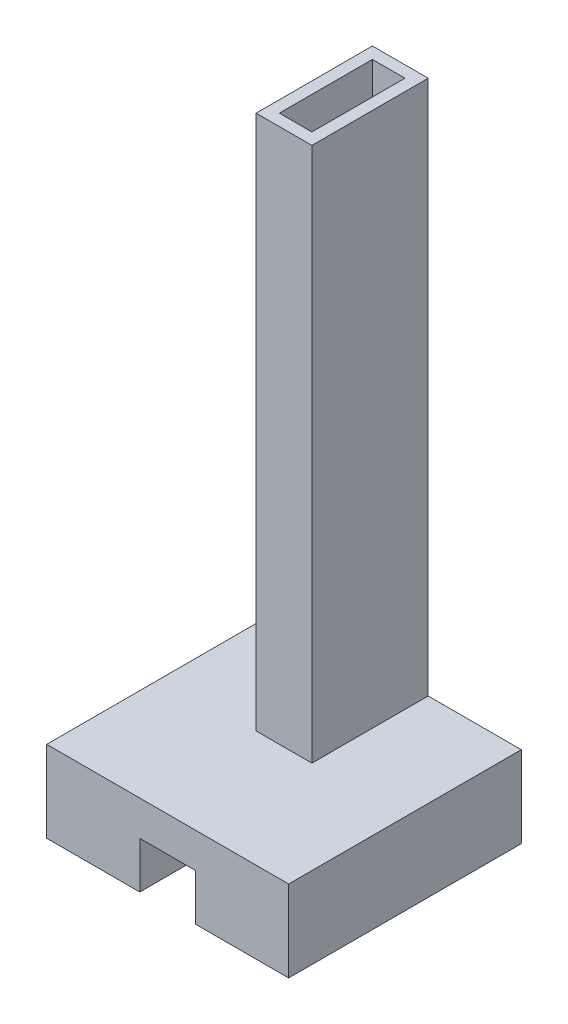
ISO-10303-21;
HEADER;
FILE_DESCRIPTION(('STEP AP214'),'2;1');
FILE_NAME('part.step','',(''),(''),'','','');
FILE_SCHEMA(('AUTOMOTIVE_DESIGN { 1 0 10303 214 1 1 1 1 }'));
ENDSEC;
DATA;
#1=APPLICATION_CONTEXT('core data for automotive mechanical design processes');
#2=APPLICATION_PROTOCOL_DEFINITION('international standard','automotive_design',2000,#1);
#3=PRODUCT_CONTEXT('',#1,'mechanical');
#4=PRODUCT('Part','Part','',(#3));
#5=PRODUCT_RELATED_PRODUCT_CATEGORY('part','',(#4));
#6=PRODUCT_DEFINITION_FORMATION('','',#4);
#7=PRODUCT_DEFINITION_CONTEXT('part definition',#1,'design');
#8=PRODUCT_DEFINITION('design','',#6,#7);
#9=PRODUCT_DEFINITION_SHAPE('','',#8);
#10=(LENGTH_UNIT() NAMED_UNIT(*) SI_UNIT(.MILLI.,.METRE.));
#11=(NAMED_UNIT(*) PLANE_ANGLE_UNIT() SI_UNIT($,.RADIAN.));
#12=(NAMED_UNIT(*) SI_UNIT($,.STERADIAN.) SOLID_ANGLE_UNIT());
#13=UNCERTAINTY_MEASURE_WITH_UNIT(LENGTH_MEASURE(1.E-05),#10,'distance_accuracy_value','');
#14=(GEOMETRIC_REPRESENTATION_CONTEXT(3) GLOBAL_UNCERTAINTY_ASSIGNED_CONTEXT((#13)) GLOBAL_UNIT_ASSIGNED_CONTEXT((#10,
#11,#12)) REPRESENTATION_CONTEXT('',''));
#15=CARTESIAN_POINT('',(0.,0.,0.));
#16=DIRECTION('',(0.,0.,1.));
#17=DIRECTION('',(1.,0.,0.));
#18=AXIS2_PLACEMENT_3D('',#15,#16,#17);
#19=CARTESIAN_POINT('',(0.,350.,1000.));
#20=DIRECTION('',(0.,-1.,0.));
#21=DIRECTION('',(0.,0.,-1.));
#22=AXIS2_PLACEMENT_3D('',#19,#20,#21);
#23=PLANE('',#22);
#24=DIRECTION('',(0.,0.,1.));
#25=VECTOR('',#24,1.);
#26=CARTESIAN_POINT('',(400.,350.,0.));
#27=LINE('',#26,#25);
#28=CARTESIAN_POINT('',(400.,350.,0.));
#29=VERTEX_POINT('',#28);
#30=CARTESIAN_POINT('',(400.,350.,500.));
#31=VERTEX_POINT('',#30);
#32=EDGE_CURVE('E200',#29,#31,#27,.T.);
#33=ORIENTED_EDGE('',*,*,#32,.F.);
#34=DIRECTION('',(-1.,0.,0.));
#35=VECTOR('',#34,1.);
#36=CARTESIAN_POINT('',(0.,350.,0.));
#37=LINE('',#36,#35);
#38=CARTESIAN_POINT('',(0.,350.,0.));
#39=VERTEX_POINT('',#38);
#40=EDGE_CURVE('E306',#29,#39,#37,.T.);
#41=ORIENTED_EDGE('',*,*,#40,.T.);
#42=DIRECTION('',(0.,0.,-1.));
#43=VECTOR('',#42,1.);
#44=CARTESIAN_POINT('',(0.,350.,1000.));
#45=LINE('',#44,#43);
#46=CARTESIAN_POINT('',(0.,350.,1000.));
#47=VERTEX_POINT('',#46);
#48=EDGE_CURVE('E294',#47,#39,#45,.T.);
#49=ORIENTED_EDGE('',*,*,#48,.F.);
#50=DIRECTION('',(-1.,0.,0.));
#51=VECTOR('',#50,1.);
#52=CARTESIAN_POINT('',(0.,350.,1000.));
#53=LINE('',#52,#51);
#54=CARTESIAN_POINT('',(1040.,350.,1000.));
#55=VERTEX_POINT('',#54);
#56=EDGE_CURVE('E291',#55,#47,#53,.T.);
#57=ORIENTED_EDGE('',*,*,#56,.F.);
#58=DIRECTION('',(0.,0.,-1.));
#59=VECTOR('',#58,1.);
#60=CARTESIAN_POINT('',(1040.,350.,1000.));
#61=LINE('',#60,#59);
#62=CARTESIAN_POINT('',(1040.,350.,0.));
#63=VERTEX_POINT('',#62);
#64=EDGE_CURVE('E312',#55,#63,#61,.T.);
#65=ORIENTED_EDGE('',*,*,#64,.T.);
#66=CARTESIAN_POINT('',(640.,350.,0.));
#67=VERTEX_POINT('',#66);
#68=EDGE_CURVE('E283',#63,#67,#37,.T.);
#69=ORIENTED_EDGE('',*,*,#68,.T.);
#70=DIRECTION('',(0.,0.,-1.));
#71=VECTOR('',#70,1.);
#72=CARTESIAN_POINT('',(640.,350.,0.));
#73=LINE('',#72,#71);
#74=CARTESIAN_POINT('',(640.,350.,500.));
#75=VERTEX_POINT('',#74);
#76=EDGE_CURVE('E206',#75,#67,#73,.T.);
#77=ORIENTED_EDGE('',*,*,#76,.F.);
#78=DIRECTION('',(1.,0.,0.));
#79=VECTOR('',#78,1.);
#80=CARTESIAN_POINT('',(400.,350.,500.));
#81=LINE('',#80,#79);
#82=EDGE_CURVE('E219',#31,#75,#81,.T.);
#83=ORIENTED_EDGE('',*,*,#82,.F.);
#84=EDGE_LOOP('',(#33,#41,#49,#57,#65,#69,#77,#83));
#85=FACE_BOUND('',#84,.T.);
#86=ADVANCED_FACE('F38',(#85),#23,.F.);
#87=CARTESIAN_POINT('',(0.,0.,1000.));
#88=DIRECTION('',(0.,1.,0.));
#89=DIRECTION('',(0.,0.,1.));
#90=AXIS2_PLACEMENT_3D('',#87,#88,#89);
#91=PLANE('',#90);
#92=DIRECTION('',(1.,0.,0.));
#93=VECTOR('',#92,1.);
#94=CARTESIAN_POINT('',(0.,0.,0.));
#95=LINE('',#94,#93);
#96=CARTESIAN_POINT('',(0.,0.,0.));
#97=VERTEX_POINT('',#96);
#98=CARTESIAN_POINT('',(400.,0.,0.));
#99=VERTEX_POINT('',#98);
#100=EDGE_CURVE('E299',#97,#99,#95,.T.);
#101=ORIENTED_EDGE('',*,*,#100,.T.);
#102=DIRECTION('',(0.,0.,1.));
#103=VECTOR('',#102,1.);
#104=CARTESIAN_POINT('',(400.,0.,0.));
#105=LINE('',#104,#103);
#106=CARTESIAN_POINT('',(400.,0.,1000.));
#107=VERTEX_POINT('',#106);
#108=EDGE_CURVE('E255',#99,#107,#105,.T.);
#109=ORIENTED_EDGE('',*,*,#108,.T.);
#110=DIRECTION('',(1.,0.,0.));
#111=VECTOR('',#110,1.);
#112=CARTESIAN_POINT('',(0.,0.,1000.));
#113=LINE('',#112,#111);
#114=CARTESIAN_POINT('',(0.,0.,1000.));
#115=VERTEX_POINT('',#114);
#116=EDGE_CURVE('E284',#115,#107,#113,.T.);
#117=ORIENTED_EDGE('',*,*,#116,.F.);
#118=DIRECTION('',(0.,0.,-1.));
#119=VECTOR('',#118,1.);
#120=CARTESIAN_POINT('',(0.,0.,1000.));
#121=LINE('',#120,#119);
#122=EDGE_CURVE('E11',#115,#97,#121,.T.);
#123=ORIENTED_EDGE('',*,*,#122,.T.);
#124=EDGE_LOOP('',(#101,#109,#117,#123));
#125=FACE_BOUND('',#124,.T.);
#126=ADVANCED_FACE('F361',(#125),#91,.F.);
#127=CARTESIAN_POINT('',(0.,0.,1000.));
#128=DIRECTION('',(1.,0.,0.));
#129=DIRECTION('',(0.,0.,-1.));
#130=AXIS2_PLACEMENT_3D('',#127,#128,#129);
#131=PLANE('',#130);
#132=DIRECTION('',(0.,-1.,0.));
#133=VECTOR('',#132,1.);
#134=CARTESIAN_POINT('',(0.,0.,0.));
#135=LINE('',#134,#133);
#136=EDGE_CURVE('E268',#39,#97,#135,.T.);
#137=ORIENTED_EDGE('',*,*,#136,.T.);
#138=ORIENTED_EDGE('',*,*,#122,.F.);
#139=DIRECTION('',(0.,-1.,0.));
#140=VECTOR('',#139,1.);
#141=CARTESIAN_POINT('',(0.,0.,1000.));
#142=LINE('',#141,#140);
#143=EDGE_CURVE('E278',#47,#115,#142,.T.);
#144=ORIENTED_EDGE('',*,*,#143,.F.);
#145=ORIENTED_EDGE('',*,*,#48,.T.);
#146=EDGE_LOOP('',(#137,#138,#144,#145));
#147=FACE_BOUND('',#146,.T.);
#148=ADVANCED_FACE('F40',(#147),#131,.F.);
#149=CARTESIAN_POINT('',(640.,0.,1000.));
#150=VERTEX_POINT('',#149);
#151=CARTESIAN_POINT('',(1040.,0.,1000.));
#152=VERTEX_POINT('',#151);
#153=EDGE_CURVE('E282',#150,#152,#113,.T.);
#154=ORIENTED_EDGE('',*,*,#153,.F.);
#155=DIRECTION('',(0.,0.,1.));
#156=VECTOR('',#155,1.);
#157=CARTESIAN_POINT('',(640.,0.,0.));
#158=LINE('',#157,#156);
#159=CARTESIAN_POINT('',(640.,0.,0.));
#160=VERTEX_POINT('',#159);
#161=EDGE_CURVE('E272',#160,#150,#158,.T.);
#162=ORIENTED_EDGE('',*,*,#161,.F.);
#163=CARTESIAN_POINT('',(1040.,0.,0.));
#164=VERTEX_POINT('',#163);
#165=EDGE_CURVE('E298',#160,#164,#95,.T.);
#166=ORIENTED_EDGE('',*,*,#165,.T.);
#167=DIRECTION('',(0.,0.,-1.));
#168=VECTOR('',#167,1.);
#169=CARTESIAN_POINT('',(1040.,0.,1000.));
#170=LINE('',#169,#168);
#171=EDGE_CURVE('E47',#152,#164,#170,.T.);
#172=ORIENTED_EDGE('',*,*,#171,.F.);
#173=EDGE_LOOP('',(#154,#162,#166,#172));
#174=FACE_BOUND('',#173,.T.);
#175=ADVANCED_FACE('F367',(#174),#91,.F.);
#176=CARTESIAN_POINT('',(1040.,0.,1000.));
#177=DIRECTION('',(-1.,0.,0.));
#178=DIRECTION('',(0.,0.,1.));
#179=AXIS2_PLACEMENT_3D('',#176,#177,#178);
#180=PLANE('',#179);
#181=DIRECTION('',(0.,1.,0.));
#182=VECTOR('',#181,1.);
#183=CARTESIAN_POINT('',(1040.,0.,0.));
#184=LINE('',#183,#182);
#185=EDGE_CURVE('E303',#164,#63,#184,.T.);
#186=ORIENTED_EDGE('',*,*,#185,.T.);
#187=ORIENTED_EDGE('',*,*,#64,.F.);
#188=DIRECTION('',(0.,1.,0.));
#189=VECTOR('',#188,1.);
#190=CARTESIAN_POINT('',(1040.,0.,1000.));
#191=LINE('',#190,#189);
#192=EDGE_CURVE('E288',#152,#55,#191,.T.);
#193=ORIENTED_EDGE('',*,*,#192,.F.);
#194=ORIENTED_EDGE('',*,*,#171,.T.);
#195=EDGE_LOOP('',(#186,#187,#193,#194));
#196=FACE_BOUND('',#195,.T.);
#197=ADVANCED_FACE('F321',(#196),#180,.F.);
#198=CARTESIAN_POINT('',(0.,0.,1000.));
#199=DIRECTION('',(0.,0.,-1.));
#200=DIRECTION('',(-1.,0.,0.));
#201=AXIS2_PLACEMENT_3D('',#198,#199,#200);
#202=PLANE('',#201);
#203=ORIENTED_EDGE('',*,*,#116,.T.);
#204=DIRECTION('',(0.,-1.,0.));
#205=VECTOR('',#204,1.);
#206=CARTESIAN_POINT('',(400.,0.,1000.));
#207=LINE('',#206,#205);
#208=CARTESIAN_POINT('',(400.,200.,1000.));
#209=VERTEX_POINT('',#208);
#210=EDGE_CURVE('E241',#209,#107,#207,.T.);
#211=ORIENTED_EDGE('',*,*,#210,.F.);
#212=DIRECTION('',(-1.,0.,0.));
#213=VECTOR('',#212,1.);
#214=CARTESIAN_POINT('',(400.,200.,1000.));
#215=LINE('',#214,#213);
#216=CARTESIAN_POINT('',(640.,200.,1000.));
#217=VERTEX_POINT('',#216);
#218=EDGE_CURVE('E247',#217,#209,#215,.T.);
#219=ORIENTED_EDGE('',*,*,#218,.F.);
#220=DIRECTION('',(0.,1.,0.));
#221=VECTOR('',#220,1.);
#222=CARTESIAN_POINT('',(640.,0.,1000.));
#223=LINE('',#222,#221);
#224=EDGE_CURVE('E258',#150,#217,#223,.T.);
#225=ORIENTED_EDGE('',*,*,#224,.F.);
#226=ORIENTED_EDGE('',*,*,#153,.T.);
#227=ORIENTED_EDGE('',*,*,#192,.T.);
#228=ORIENTED_EDGE('',*,*,#56,.T.);
#229=ORIENTED_EDGE('',*,*,#143,.T.);
#230=EDGE_LOOP('',(#203,#211,#219,#225,#226,#227,#228,#229));
#231=FACE_BOUND('',#230,.T.);
#232=ADVANCED_FACE('F372',(#231),#202,.F.);
#233=CARTESIAN_POINT('',(0.,0.,0.));
#234=DIRECTION('',(0.,0.,-1.));
#235=DIRECTION('',(-1.,0.,0.));
#236=AXIS2_PLACEMENT_3D('',#233,#234,#235);
#237=PLANE('',#236);
#238=DIRECTION('',(0.,-1.,0.));
#239=VECTOR('',#238,1.);
#240=CARTESIAN_POINT('',(400.,0.,0.));
#241=LINE('',#240,#239);
#242=CARTESIAN_POINT('',(400.,200.,0.));
#243=VERTEX_POINT('',#242);
#244=EDGE_CURVE('E242',#243,#99,#241,.T.);
#245=ORIENTED_EDGE('',*,*,#244,.T.);
#246=ORIENTED_EDGE('',*,*,#100,.F.);
#247=ORIENTED_EDGE('',*,*,#136,.F.);
#248=ORIENTED_EDGE('',*,*,#40,.F.);
#249=DIRECTION('',(0.,-1.,0.));
#250=VECTOR('',#249,1.);
#251=CARTESIAN_POINT('',(400.,2650.,0.));
#252=LINE('',#251,#250);
#253=CARTESIAN_POINT('',(400.,2650.,0.));
#254=VERTEX_POINT('',#253);
#255=EDGE_CURVE('E215',#254,#29,#252,.T.);
#256=ORIENTED_EDGE('',*,*,#255,.F.);
#257=DIRECTION('',(-1.,0.,0.));
#258=VECTOR('',#257,1.);
#259=CARTESIAN_POINT('',(400.,2650.,0.));
#260=LINE('',#259,#258);
#261=CARTESIAN_POINT('',(640.,2650.,0.));
#262=VERTEX_POINT('',#261);
#263=EDGE_CURVE('E212',#262,#254,#260,.T.);
#264=ORIENTED_EDGE('',*,*,#263,.F.);
#265=DIRECTION('',(0.,-1.,0.));
#266=VECTOR('',#265,1.);
#267=CARTESIAN_POINT('',(640.,2650.,0.));
#268=LINE('',#267,#266);
#269=EDGE_CURVE('E229',#262,#67,#268,.T.);
#270=ORIENTED_EDGE('',*,*,#269,.T.);
#271=ORIENTED_EDGE('',*,*,#68,.F.);
#272=ORIENTED_EDGE('',*,*,#185,.F.);
#273=ORIENTED_EDGE('',*,*,#165,.F.);
#274=DIRECTION('',(0.,1.,0.));
#275=VECTOR('',#274,1.);
#276=CARTESIAN_POINT('',(640.,0.,0.));
#277=LINE('',#276,#275);
#278=CARTESIAN_POINT('',(640.,200.,0.));
#279=VERTEX_POINT('',#278);
#280=EDGE_CURVE('E246',#160,#279,#277,.T.);
#281=ORIENTED_EDGE('',*,*,#280,.T.);
#282=DIRECTION('',(-1.,0.,0.));
#283=VECTOR('',#282,1.);
#284=CARTESIAN_POINT('',(400.,200.,0.));
#285=LINE('',#284,#283);
#286=EDGE_CURVE('E251',#279,#243,#285,.T.);
#287=ORIENTED_EDGE('',*,*,#286,.T.);
#288=EDGE_LOOP('',(#245,#246,#247,#248,#256,#264,#270,#271,#272,#273,#281,#287));
#289=FACE_BOUND('',#288,.T.);
#290=ADVANCED_FACE('F328',(#289),#237,.T.);
#291=CARTESIAN_POINT('',(400.,0.,0.));
#292=DIRECTION('',(-1.,0.,0.));
#293=DIRECTION('',(0.,0.,1.));
#294=AXIS2_PLACEMENT_3D('',#291,#292,#293);
#295=PLANE('',#294);
#296=ORIENTED_EDGE('',*,*,#210,.T.);
#297=ORIENTED_EDGE('',*,*,#108,.F.);
#298=ORIENTED_EDGE('',*,*,#244,.F.);
#299=DIRECTION('',(0.,0.,1.));
#300=VECTOR('',#299,1.);
#301=CARTESIAN_POINT('',(400.,200.,0.));
#302=LINE('',#301,#300);
#303=EDGE_CURVE('E265',#243,#209,#302,.T.);
#304=ORIENTED_EDGE('',*,*,#303,.T.);
#305=EDGE_LOOP('',(#296,#297,#298,#304));
#306=FACE_BOUND('',#305,.T.);
#307=ADVANCED_FACE('F392',(#306),#295,.F.);
#308=CARTESIAN_POINT('',(400.,200.,0.));
#309=DIRECTION('',(0.,1.,0.));
#310=DIRECTION('',(0.,0.,1.));
#311=AXIS2_PLACEMENT_3D('',#308,#309,#310);
#312=PLANE('',#311);
#313=DIRECTION('',(-1.,0.,0.));
#314=VECTOR('',#313,1.);
#315=CARTESIAN_POINT('',(400.,200.,50.));
#316=LINE('',#315,#314);
#317=CARTESIAN_POINT('',(590.,200.,50.));
#318=VERTEX_POINT('',#317);
#319=CARTESIAN_POINT('',(450.,200.,50.));
#320=VERTEX_POINT('',#319);
#321=EDGE_CURVE('E192',#318,#320,#316,.T.);
#322=ORIENTED_EDGE('',*,*,#321,.T.);
#323=DIRECTION('',(0.,0.,1.));
#324=VECTOR('',#323,1.);
#325=CARTESIAN_POINT('',(450.,200.,0.));
#326=LINE('',#325,#324);
#327=CARTESIAN_POINT('',(450.,200.,450.));
#328=VERTEX_POINT('',#327);
#329=EDGE_CURVE('E196',#320,#328,#326,.T.);
#330=ORIENTED_EDGE('',*,*,#329,.T.);
#331=DIRECTION('',(1.,0.,0.));
#332=VECTOR('',#331,1.);
#333=CARTESIAN_POINT('',(400.,200.,450.));
#334=LINE('',#333,#332);
#335=CARTESIAN_POINT('',(590.,200.,450.));
#336=VERTEX_POINT('',#335);
#337=EDGE_CURVE('E183',#328,#336,#334,.T.);
#338=ORIENTED_EDGE('',*,*,#337,.T.);
#339=DIRECTION('',(0.,0.,-1.));
#340=VECTOR('',#339,1.);
#341=CARTESIAN_POINT('',(590.,200.,0.));
#342=LINE('',#341,#340);
#343=EDGE_CURVE('E158',#336,#318,#342,.T.);
#344=ORIENTED_EDGE('',*,*,#343,.T.);
#345=EDGE_LOOP('',(#322,#330,#338,#344));
#346=FACE_BOUND('',#345,.T.);
#347=ORIENTED_EDGE('',*,*,#218,.T.);
#348=ORIENTED_EDGE('',*,*,#303,.F.);
#349=ORIENTED_EDGE('',*,*,#286,.F.);
#350=DIRECTION('',(0.,0.,1.));
#351=VECTOR('',#350,1.);
#352=CARTESIAN_POINT('',(640.,200.,0.));
#353=LINE('',#352,#351);
#354=EDGE_CURVE('E269',#279,#217,#353,.T.);
#355=ORIENTED_EDGE('',*,*,#354,.T.);
#356=EDGE_LOOP('',(#347,#348,#349,#355));
#357=FACE_BOUND('',#356,.T.);
#358=ADVANCED_FACE('F390',(#346,#357),#312,.F.);
#359=CARTESIAN_POINT('',(640.,0.,0.));
#360=DIRECTION('',(1.,0.,0.));
#361=DIRECTION('',(0.,0.,-1.));
#362=AXIS2_PLACEMENT_3D('',#359,#360,#361);
#363=PLANE('',#362);
#364=ORIENTED_EDGE('',*,*,#224,.T.);
#365=ORIENTED_EDGE('',*,*,#354,.F.);
#366=ORIENTED_EDGE('',*,*,#280,.F.);
#367=ORIENTED_EDGE('',*,*,#161,.T.);
#368=EDGE_LOOP('',(#364,#365,#366,#367));
#369=FACE_BOUND('',#368,.T.);
#370=ADVANCED_FACE('F387',(#369),#363,.F.);
#371=CARTESIAN_POINT('',(400.,2650.,0.));
#372=DIRECTION('',(1.,0.,0.));
#373=DIRECTION('',(0.,0.,-1.));
#374=AXIS2_PLACEMENT_3D('',#371,#372,#373);
#375=PLANE('',#374);
#376=ORIENTED_EDGE('',*,*,#32,.T.);
#377=DIRECTION('',(0.,-1.,0.));
#378=VECTOR('',#377,1.);
#379=CARTESIAN_POINT('',(400.,2650.,500.));
#380=LINE('',#379,#378);
#381=CARTESIAN_POINT('',(400.,2650.,500.));
#382=VERTEX_POINT('',#381);
#383=EDGE_CURVE('E237',#382,#31,#380,.T.);
#384=ORIENTED_EDGE('',*,*,#383,.F.);
#385=DIRECTION('',(0.,0.,1.));
#386=VECTOR('',#385,1.);
#387=CARTESIAN_POINT('',(400.,2650.,0.));
#388=LINE('',#387,#386);
#389=EDGE_CURVE('E201',#254,#382,#388,.T.);
#390=ORIENTED_EDGE('',*,*,#389,.F.);
#391=ORIENTED_EDGE('',*,*,#255,.T.);
#392=EDGE_LOOP('',(#376,#384,#390,#391));
#393=FACE_BOUND('',#392,.T.);
#394=ADVANCED_FACE('F347',(#393),#375,.F.);
#395=CARTESIAN_POINT('',(400.,2650.,500.));
#396=DIRECTION('',(0.,0.,-1.));
#397=DIRECTION('',(-1.,0.,0.));
#398=AXIS2_PLACEMENT_3D('',#395,#396,#397);
#399=PLANE('',#398);
#400=ORIENTED_EDGE('',*,*,#82,.T.);
#401=DIRECTION('',(0.,-1.,0.));
#402=VECTOR('',#401,1.);
#403=CARTESIAN_POINT('',(640.,2650.,500.));
#404=LINE('',#403,#402);
#405=CARTESIAN_POINT('',(640.,2650.,500.));
#406=VERTEX_POINT('',#405);
#407=EDGE_CURVE('E233',#406,#75,#404,.T.);
#408=ORIENTED_EDGE('',*,*,#407,.F.);
#409=DIRECTION('',(1.,0.,0.));
#410=VECTOR('',#409,1.);
#411=CARTESIAN_POINT('',(400.,2650.,500.));
#412=LINE('',#411,#410);
#413=EDGE_CURVE('E205',#382,#406,#412,.T.);
#414=ORIENTED_EDGE('',*,*,#413,.F.);
#415=ORIENTED_EDGE('',*,*,#383,.T.);
#416=EDGE_LOOP('',(#400,#408,#414,#415));
#417=FACE_BOUND('',#416,.T.);
#418=ADVANCED_FACE('F338',(#417),#399,.F.);
#419=CARTESIAN_POINT('',(640.,2650.,0.));
#420=DIRECTION('',(-1.,0.,0.));
#421=DIRECTION('',(0.,0.,1.));
#422=AXIS2_PLACEMENT_3D('',#419,#420,#421);
#423=PLANE('',#422);
#424=ORIENTED_EDGE('',*,*,#76,.T.);
#425=ORIENTED_EDGE('',*,*,#269,.F.);
#426=DIRECTION('',(0.,0.,-1.));
#427=VECTOR('',#426,1.);
#428=CARTESIAN_POINT('',(640.,2650.,0.));
#429=LINE('',#428,#427);
#430=EDGE_CURVE('E209',#406,#262,#429,.T.);
#431=ORIENTED_EDGE('',*,*,#430,.F.);
#432=ORIENTED_EDGE('',*,*,#407,.T.);
#433=EDGE_LOOP('',(#424,#425,#431,#432));
#434=FACE_BOUND('',#433,.T.);
#435=ADVANCED_FACE('F334',(#434),#423,.F.);
#436=CARTESIAN_POINT('',(0.,2650.,0.));
#437=DIRECTION('',(0.,1.,0.));
#438=DIRECTION('',(0.,0.,1.));
#439=AXIS2_PLACEMENT_3D('',#436,#437,#438);
#440=PLANE('',#439);
#441=DIRECTION('',(0.,0.,1.));
#442=VECTOR('',#441,1.);
#443=CARTESIAN_POINT('',(450.,2650.,50.));
#444=LINE('',#443,#442);
#445=CARTESIAN_POINT('',(450.,2650.,50.));
#446=VERTEX_POINT('',#445);
#447=CARTESIAN_POINT('',(450.,2650.,450.));
#448=VERTEX_POINT('',#447);
#449=EDGE_CURVE('E62',#446,#448,#444,.T.);
#450=ORIENTED_EDGE('',*,*,#449,.F.);
#451=DIRECTION('',(-1.,0.,0.));
#452=VECTOR('',#451,1.);
#453=CARTESIAN_POINT('',(450.,2650.,50.));
#454=LINE('',#453,#452);
#455=CARTESIAN_POINT('',(590.,2650.,50.));
#456=VERTEX_POINT('',#455);
#457=EDGE_CURVE('E173',#456,#446,#454,.T.);
#458=ORIENTED_EDGE('',*,*,#457,.F.);
#459=DIRECTION('',(0.,0.,-1.));
#460=VECTOR('',#459,1.);
#461=CARTESIAN_POINT('',(590.,2650.,50.));
#462=LINE('',#461,#460);
#463=CARTESIAN_POINT('',(590.,2650.,450.));
#464=VERTEX_POINT('',#463);
#465=EDGE_CURVE('E155',#464,#456,#462,.T.);
#466=ORIENTED_EDGE('',*,*,#465,.F.);
#467=DIRECTION('',(1.,0.,0.));
#468=VECTOR('',#467,1.);
#469=CARTESIAN_POINT('',(450.,2650.,450.));
#470=LINE('',#469,#468);
#471=EDGE_CURVE('E165',#448,#464,#470,.T.);
#472=ORIENTED_EDGE('',*,*,#471,.F.);
#473=EDGE_LOOP('',(#450,#458,#466,#472));
#474=FACE_BOUND('',#473,.T.);
#475=ORIENTED_EDGE('',*,*,#389,.T.);
#476=ORIENTED_EDGE('',*,*,#413,.T.);
#477=ORIENTED_EDGE('',*,*,#430,.T.);
#478=ORIENTED_EDGE('',*,*,#263,.T.);
#479=EDGE_LOOP('',(#475,#476,#477,#478));
#480=FACE_BOUND('',#479,.T.);
#481=ADVANCED_FACE('F170',(#474,#480),#440,.T.);
#482=CARTESIAN_POINT('',(450.,0.,50.));
#483=DIRECTION('',(-1.,0.,0.));
#484=DIRECTION('',(0.,0.,1.));
#485=AXIS2_PLACEMENT_3D('',#482,#483,#484);
#486=PLANE('',#485);
#487=DIRECTION('',(0.,1.,0.));
#488=VECTOR('',#487,1.);
#489=CARTESIAN_POINT('',(450.,0.,50.));
#490=LINE('',#489,#488);
#491=EDGE_CURVE('E180',#320,#446,#490,.T.);
#492=ORIENTED_EDGE('',*,*,#491,.T.);
#493=ORIENTED_EDGE('',*,*,#449,.T.);
#494=DIRECTION('',(0.,1.,0.));
#495=VECTOR('',#494,1.);
#496=CARTESIAN_POINT('',(450.,0.,450.));
#497=LINE('',#496,#495);
#498=EDGE_CURVE('E162',#328,#448,#497,.T.);
#499=ORIENTED_EDGE('',*,*,#498,.F.);
#500=ORIENTED_EDGE('',*,*,#329,.F.);
#501=EDGE_LOOP('',(#492,#493,#499,#500));
#502=FACE_BOUND('',#501,.T.);
#503=ADVANCED_FACE('F349',(#502),#486,.F.);
#504=CARTESIAN_POINT('',(450.,0.,50.));
#505=DIRECTION('',(0.,0.,-1.));
#506=DIRECTION('',(-1.,0.,0.));
#507=AXIS2_PLACEMENT_3D('',#504,#505,#506);
#508=PLANE('',#507);
#509=DIRECTION('',(0.,1.,0.));
#510=VECTOR('',#509,1.);
#511=CARTESIAN_POINT('',(590.,0.,50.));
#512=LINE('',#511,#510);
#513=EDGE_CURVE('E161',#318,#456,#512,.T.);
#514=ORIENTED_EDGE('',*,*,#513,.T.);
#515=ORIENTED_EDGE('',*,*,#457,.T.);
#516=ORIENTED_EDGE('',*,*,#491,.F.);
#517=ORIENTED_EDGE('',*,*,#321,.F.);
#518=EDGE_LOOP('',(#514,#515,#516,#517));
#519=FACE_BOUND('',#518,.T.);
#520=ADVANCED_FACE('F356',(#519),#508,.F.);
#521=CARTESIAN_POINT('',(590.,0.,50.));
#522=DIRECTION('',(1.,0.,0.));
#523=DIRECTION('',(0.,0.,-1.));
#524=AXIS2_PLACEMENT_3D('',#521,#522,#523);
#525=PLANE('',#524);
#526=DIRECTION('',(0.,1.,0.));
#527=VECTOR('',#526,1.);
#528=CARTESIAN_POINT('',(590.,0.,450.));
#529=LINE('',#528,#527);
#530=EDGE_CURVE('E54',#336,#464,#529,.T.);
#531=ORIENTED_EDGE('',*,*,#530,.T.);
#532=ORIENTED_EDGE('',*,*,#465,.T.);
#533=ORIENTED_EDGE('',*,*,#513,.F.);
#534=ORIENTED_EDGE('',*,*,#343,.F.);
#535=EDGE_LOOP('',(#531,#532,#533,#534));
#536=FACE_BOUND('',#535,.T.);
#537=ADVANCED_FACE('F152',(#536),#525,.F.);
#538=CARTESIAN_POINT('',(450.,0.,450.));
#539=DIRECTION('',(0.,0.,1.));
#540=DIRECTION('',(1.,0.,0.));
#541=AXIS2_PLACEMENT_3D('',#538,#539,#540);
#542=PLANE('',#541);
#543=ORIENTED_EDGE('',*,*,#498,.T.);
#544=ORIENTED_EDGE('',*,*,#471,.T.);
#545=ORIENTED_EDGE('',*,*,#530,.F.);
#546=ORIENTED_EDGE('',*,*,#337,.F.);
#547=EDGE_LOOP('',(#543,#544,#545,#546));
#548=FACE_BOUND('',#547,.T.);
#549=ADVANCED_FACE('F166',(#548),#542,.F.);
#550=CLOSED_SHELL('',(#86,#126,#148,#175,#197,#232,#290,#307,#358,#370,#394,#418,#435,#481,#503,
#520,#537,#549));
#551=MANIFOLD_SOLID_BREP('B2',#550);
#552=ADVANCED_BREP_SHAPE_REPRESENTATION('',(#18,#551),#14);
#553=SHAPE_DEFINITION_REPRESENTATION(#9,#552);
ENDSEC;
END-ISO-10303-21;
